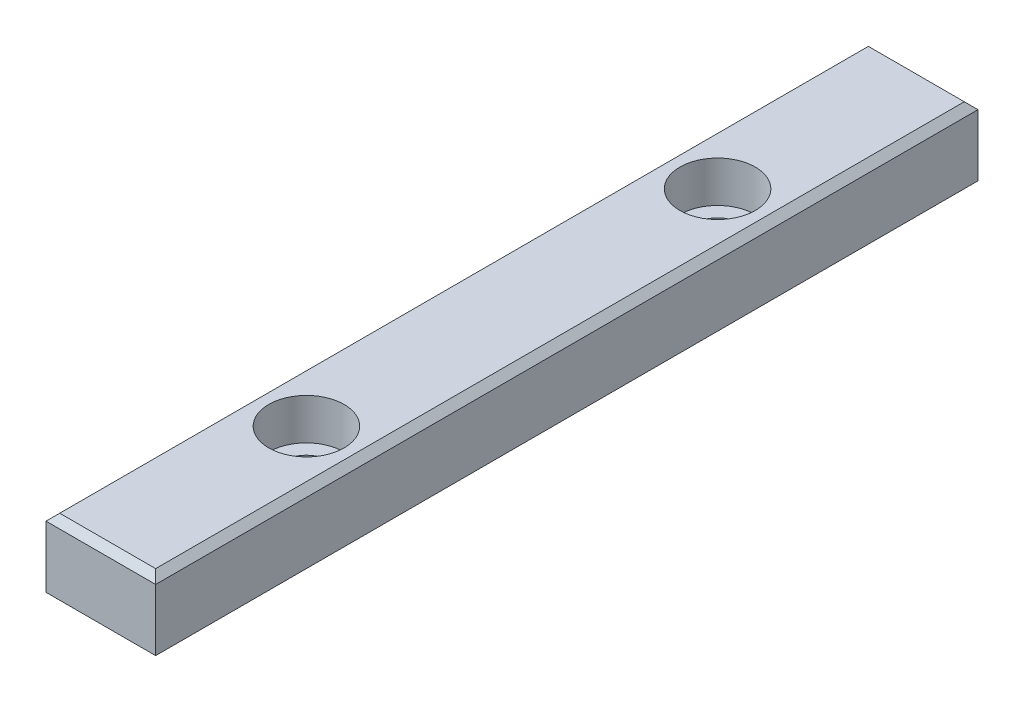
ISO-10303-21;
HEADER;
FILE_DESCRIPTION(('STEP AP214'),'2;1');
FILE_NAME('part.step','',(''),(''),'','','');
FILE_SCHEMA(('AUTOMOTIVE_DESIGN { 1 0 10303 214 1 1 1 1 }'));
ENDSEC;
DATA;
#1=APPLICATION_CONTEXT('core data for automotive mechanical design processes');
#2=APPLICATION_PROTOCOL_DEFINITION('international standard','automotive_design',2000,#1);
#3=PRODUCT_CONTEXT('',#1,'mechanical');
#4=PRODUCT('Part','Part','',(#3));
#5=PRODUCT_RELATED_PRODUCT_CATEGORY('part','',(#4));
#6=PRODUCT_DEFINITION_FORMATION('','',#4);
#7=PRODUCT_DEFINITION_CONTEXT('part definition',#1,'design');
#8=PRODUCT_DEFINITION('design','',#6,#7);
#9=PRODUCT_DEFINITION_SHAPE('','',#8);
#10=(LENGTH_UNIT() NAMED_UNIT(*) SI_UNIT(.MILLI.,.METRE.));
#11=(NAMED_UNIT(*) PLANE_ANGLE_UNIT() SI_UNIT($,.RADIAN.));
#12=(NAMED_UNIT(*) SI_UNIT($,.STERADIAN.) SOLID_ANGLE_UNIT());
#13=UNCERTAINTY_MEASURE_WITH_UNIT(LENGTH_MEASURE(1.E-05),#10,'distance_accuracy_value','');
#14=(GEOMETRIC_REPRESENTATION_CONTEXT(3) GLOBAL_UNCERTAINTY_ASSIGNED_CONTEXT((#13)) GLOBAL_UNIT_ASSIGNED_CONTEXT((#10,
#11,#12)) REPRESENTATION_CONTEXT('',''));
#15=CARTESIAN_POINT('',(0.,0.,0.));
#16=DIRECTION('',(0.,0.,1.));
#17=DIRECTION('',(1.,0.,0.));
#18=AXIS2_PLACEMENT_3D('',#15,#16,#17);
#19=CARTESIAN_POINT('',(7.99999999999999,-10.,60.));
#20=DIRECTION('',(1.,0.,0.));
#21=DIRECTION('',(0.,0.,-1.));
#22=AXIS2_PLACEMENT_3D('',#19,#20,#21);
#23=PLANE('',#22);
#24=DIRECTION('',(0.,1.,0.));
#25=VECTOR('',#24,1.);
#26=CARTESIAN_POINT('',(7.99999999999999,-10.,-60.));
#27=LINE('',#26,#25);
#28=CARTESIAN_POINT('',(7.99999999999999,-10.,-60.));
#29=VERTEX_POINT('',#28);
#30=CARTESIAN_POINT('',(7.99999999999999,-1.00000000000001,-60.));
#31=VERTEX_POINT('',#30);
#32=EDGE_CURVE('E85',#29,#31,#27,.T.);
#33=ORIENTED_EDGE('',*,*,#32,.T.);
#34=DIRECTION('',(0.,0.,1.));
#35=VECTOR('',#34,1.);
#36=CARTESIAN_POINT('',(7.99999999999999,-1.00000000000001,60.));
#37=LINE('',#36,#35);
#38=CARTESIAN_POINT('',(7.99999999999999,-1.00000000000001,60.));
#39=VERTEX_POINT('',#38);
#40=EDGE_CURVE('E131',#31,#39,#37,.T.);
#41=ORIENTED_EDGE('',*,*,#40,.T.);
#42=DIRECTION('',(0.,1.,0.));
#43=VECTOR('',#42,1.);
#44=CARTESIAN_POINT('',(7.99999999999999,-10.,60.));
#45=LINE('',#44,#43);
#46=CARTESIAN_POINT('',(7.99999999999999,-10.,60.));
#47=VERTEX_POINT('',#46);
#48=EDGE_CURVE('E108',#47,#39,#45,.T.);
#49=ORIENTED_EDGE('',*,*,#48,.F.);
#50=DIRECTION('',(0.,0.,-1.));
#51=VECTOR('',#50,1.);
#52=CARTESIAN_POINT('',(7.99999999999999,-10.,60.));
#53=LINE('',#52,#51);
#54=EDGE_CURVE('E103',#47,#29,#53,.T.);
#55=ORIENTED_EDGE('',*,*,#54,.T.);
#56=EDGE_LOOP('',(#33,#41,#49,#55));
#57=FACE_BOUND('',#56,.T.);
#58=ADVANCED_FACE('F32',(#57),#23,.T.);
#59=CARTESIAN_POINT('',(7.99999999999999,-10.,60.));
#60=DIRECTION('',(0.,0.,1.));
#61=DIRECTION('',(1.,0.,0.));
#62=AXIS2_PLACEMENT_3D('',#59,#60,#61);
#63=PLANE('',#62);
#64=ORIENTED_EDGE('',*,*,#48,.T.);
#65=DIRECTION('',(-1.,0.,0.));
#66=VECTOR('',#65,1.);
#67=CARTESIAN_POINT('',(7.99999999999999,-1.00000000000001,60.));
#68=LINE('',#67,#66);
#69=CARTESIAN_POINT('',(-8.00000000000001,-1.00000000000001,60.));
#70=VERTEX_POINT('',#69);
#71=EDGE_CURVE('E11',#39,#70,#68,.T.);
#72=ORIENTED_EDGE('',*,*,#71,.T.);
#73=DIRECTION('',(0.,1.,0.));
#74=VECTOR('',#73,1.);
#75=CARTESIAN_POINT('',(-8.00000000000001,-10.,60.));
#76=LINE('',#75,#74);
#77=CARTESIAN_POINT('',(-8.00000000000001,-10.,60.));
#78=VERTEX_POINT('',#77);
#79=EDGE_CURVE('E120',#78,#70,#76,.T.);
#80=ORIENTED_EDGE('',*,*,#79,.F.);
#81=DIRECTION('',(1.,0.,0.));
#82=VECTOR('',#81,1.);
#83=CARTESIAN_POINT('',(7.99999999999999,-10.,60.));
#84=LINE('',#83,#82);
#85=EDGE_CURVE('E96',#78,#47,#84,.T.);
#86=ORIENTED_EDGE('',*,*,#85,.T.);
#87=EDGE_LOOP('',(#64,#72,#80,#86));
#88=FACE_BOUND('',#87,.T.);
#89=ADVANCED_FACE('F154',(#88),#63,.T.);
#90=CARTESIAN_POINT('',(-8.00000000000001,-10.,60.));
#91=DIRECTION('',(-1.,0.,0.));
#92=DIRECTION('',(0.,0.,1.));
#93=AXIS2_PLACEMENT_3D('',#90,#91,#92);
#94=PLANE('',#93);
#95=ORIENTED_EDGE('',*,*,#79,.T.);
#96=DIRECTION('',(0.,0.,-1.));
#97=VECTOR('',#96,1.);
#98=CARTESIAN_POINT('',(-8.00000000000001,-1.00000000000001,60.));
#99=LINE('',#98,#97);
#100=CARTESIAN_POINT('',(-8.00000000000001,-1.00000000000001,-60.));
#101=VERTEX_POINT('',#100);
#102=EDGE_CURVE('E41',#70,#101,#99,.T.);
#103=ORIENTED_EDGE('',*,*,#102,.T.);
#104=DIRECTION('',(0.,1.,0.));
#105=VECTOR('',#104,1.);
#106=CARTESIAN_POINT('',(-8.00000000000001,-10.,-60.));
#107=LINE('',#106,#105);
#108=CARTESIAN_POINT('',(-8.00000000000001,-10.,-60.));
#109=VERTEX_POINT('',#108);
#110=EDGE_CURVE('E95',#109,#101,#107,.T.);
#111=ORIENTED_EDGE('',*,*,#110,.F.);
#112=DIRECTION('',(0.,0.,1.));
#113=VECTOR('',#112,1.);
#114=CARTESIAN_POINT('',(-8.00000000000001,-10.,60.));
#115=LINE('',#114,#113);
#116=EDGE_CURVE('E106',#109,#78,#115,.T.);
#117=ORIENTED_EDGE('',*,*,#116,.T.);
#118=EDGE_LOOP('',(#95,#103,#111,#117));
#119=FACE_BOUND('',#118,.T.);
#120=ADVANCED_FACE('F155',(#119),#94,.T.);
#121=CARTESIAN_POINT('',(7.99999999999999,-10.,-60.));
#122=DIRECTION('',(0.,0.,-1.));
#123=DIRECTION('',(-1.,0.,0.));
#124=AXIS2_PLACEMENT_3D('',#121,#122,#123);
#125=PLANE('',#124);
#126=ORIENTED_EDGE('',*,*,#110,.T.);
#127=DIRECTION('',(1.,0.,0.));
#128=VECTOR('',#127,1.);
#129=CARTESIAN_POINT('',(7.99999999999999,-1.00000000000001,-60.));
#130=LINE('',#129,#128);
#131=EDGE_CURVE('E90',#101,#31,#130,.T.);
#132=ORIENTED_EDGE('',*,*,#131,.T.);
#133=ORIENTED_EDGE('',*,*,#32,.F.);
#134=DIRECTION('',(-1.,0.,0.));
#135=VECTOR('',#134,1.);
#136=CARTESIAN_POINT('',(7.99999999999999,-10.,-60.));
#137=LINE('',#136,#135);
#138=EDGE_CURVE('E88',#29,#109,#137,.T.);
#139=ORIENTED_EDGE('',*,*,#138,.T.);
#140=EDGE_LOOP('',(#126,#132,#133,#139));
#141=FACE_BOUND('',#140,.T.);
#142=ADVANCED_FACE('F87',(#141),#125,.T.);
#143=CARTESIAN_POINT('',(7.99999999999999,-10.,-60.));
#144=DIRECTION('',(0.,1.,0.));
#145=DIRECTION('',(0.,0.,1.));
#146=AXIS2_PLACEMENT_3D('',#143,#144,#145);
#147=PLANE('',#146);
#148=CARTESIAN_POINT('',(0.,-10.,30.));
#149=DIRECTION('',(0.,1.,0.));
#150=DIRECTION('',(0.,0.,1.));
#151=AXIS2_PLACEMENT_3D('',#148,#149,#150);
#152=CIRCLE('',#151,3.3);
#153=CARTESIAN_POINT('',(0.,-10.,33.3));
#154=VERTEX_POINT('',#153);
#155=EDGE_CURVE('E228',#154,#154,#152,.T.);
#156=ORIENTED_EDGE('',*,*,#155,.T.);
#157=EDGE_LOOP('',(#156));
#158=FACE_BOUND('',#157,.T.);
#159=CARTESIAN_POINT('',(0.,-10.,-30.));
#160=DIRECTION('',(0.,1.,0.));
#161=DIRECTION('',(0.,0.,1.));
#162=AXIS2_PLACEMENT_3D('',#159,#160,#161);
#163=CIRCLE('',#162,3.3);
#164=CARTESIAN_POINT('',(0.,-10.,-26.7));
#165=VERTEX_POINT('',#164);
#166=EDGE_CURVE('E113',#165,#165,#163,.T.);
#167=ORIENTED_EDGE('',*,*,#166,.T.);
#168=EDGE_LOOP('',(#167));
#169=FACE_BOUND('',#168,.T.);
#170=ORIENTED_EDGE('',*,*,#54,.F.);
#171=ORIENTED_EDGE('',*,*,#85,.F.);
#172=ORIENTED_EDGE('',*,*,#116,.F.);
#173=ORIENTED_EDGE('',*,*,#138,.F.);
#174=EDGE_LOOP('',(#170,#171,#172,#173));
#175=FACE_BOUND('',#174,.T.);
#176=ADVANCED_FACE('F101',(#158,#169,#175),#147,.F.);
#177=CARTESIAN_POINT('',(7.99999999999999,0.,-60.));
#178=DIRECTION('',(0.,1.,0.));
#179=DIRECTION('',(0.,0.,1.));
#180=AXIS2_PLACEMENT_3D('',#177,#178,#179);
#181=PLANE('',#180);
#182=CARTESIAN_POINT('',(0.,0.,30.));
#183=DIRECTION('',(0.,1.,0.));
#184=DIRECTION('',(0.,0.,1.));
#185=AXIS2_PLACEMENT_3D('',#182,#183,#184);
#186=CIRCLE('',#185,5.49999999999999);
#187=CARTESIAN_POINT('',(0.,0.,35.5));
#188=VERTEX_POINT('',#187);
#189=EDGE_CURVE('E221',#188,#188,#186,.T.);
#190=ORIENTED_EDGE('',*,*,#189,.F.);
#191=EDGE_LOOP('',(#190));
#192=FACE_BOUND('',#191,.T.);
#193=CARTESIAN_POINT('',(0.,0.,-30.));
#194=DIRECTION('',(0.,1.,0.));
#195=DIRECTION('',(0.,0.,1.));
#196=AXIS2_PLACEMENT_3D('',#193,#194,#195);
#197=CIRCLE('',#196,5.49999999999999);
#198=CARTESIAN_POINT('',(0.,0.,-24.5));
#199=VERTEX_POINT('',#198);
#200=EDGE_CURVE('E231',#199,#199,#197,.T.);
#201=ORIENTED_EDGE('',*,*,#200,.F.);
#202=EDGE_LOOP('',(#201));
#203=FACE_BOUND('',#202,.T.);
#204=DIRECTION('',(1.,0.,0.));
#205=VECTOR('',#204,1.);
#206=CARTESIAN_POINT('',(7.99999999999999,0.,59.));
#207=LINE('',#206,#205);
#208=CARTESIAN_POINT('',(-7.,0.,59.));
#209=VERTEX_POINT('',#208);
#210=CARTESIAN_POINT('',(6.99999999999999,0.,59.));
#211=VERTEX_POINT('',#210);
#212=EDGE_CURVE('E119',#209,#211,#207,.T.);
#213=ORIENTED_EDGE('',*,*,#212,.T.);
#214=DIRECTION('',(0.,0.,-1.));
#215=VECTOR('',#214,1.);
#216=CARTESIAN_POINT('',(6.99999999999999,0.,-60.));
#217=LINE('',#216,#215);
#218=CARTESIAN_POINT('',(6.99999999999999,0.,-59.));
#219=VERTEX_POINT('',#218);
#220=EDGE_CURVE('E128',#211,#219,#217,.T.);
#221=ORIENTED_EDGE('',*,*,#220,.T.);
#222=DIRECTION('',(-1.,0.,0.));
#223=VECTOR('',#222,1.);
#224=CARTESIAN_POINT('',(7.99999999999999,0.,-59.));
#225=LINE('',#224,#223);
#226=CARTESIAN_POINT('',(-7.,0.,-59.));
#227=VERTEX_POINT('',#226);
#228=EDGE_CURVE('E126',#219,#227,#225,.T.);
#229=ORIENTED_EDGE('',*,*,#228,.T.);
#230=DIRECTION('',(0.,0.,1.));
#231=VECTOR('',#230,1.);
#232=CARTESIAN_POINT('',(-7.,0.,-60.));
#233=LINE('',#232,#231);
#234=EDGE_CURVE('E124',#227,#209,#233,.T.);
#235=ORIENTED_EDGE('',*,*,#234,.T.);
#236=EDGE_LOOP('',(#213,#221,#229,#235));
#237=FACE_BOUND('',#236,.T.);
#238=ADVANCED_FACE('F149',(#192,#203,#237),#181,.T.);
#239=CARTESIAN_POINT('',(-7.,0.,-60.));
#240=DIRECTION('',(0.707106781186552,-0.707106781186542,0.));
#241=DIRECTION('',(0.707106781186543,0.707106781186552,0.));
#242=AXIS2_PLACEMENT_3D('',#239,#240,#241);
#243=PLANE('',#242);
#244=DIRECTION('',(-0.577350269189623,-0.577350269189631,-0.577350269189623));
#245=VECTOR('',#244,1.);
#246=CARTESIAN_POINT('',(-7.33333333333333,-0.333333333333335,-59.3333333333333));
#247=LINE('',#246,#245);
#248=EDGE_CURVE('E111',#101,#227,#247,.F.);
#249=ORIENTED_EDGE('',*,*,#248,.F.);
#250=ORIENTED_EDGE('',*,*,#102,.F.);
#251=DIRECTION('',(-0.577350269189624,-0.577350269189633,0.577350269189621));
#252=VECTOR('',#251,1.);
#253=CARTESIAN_POINT('',(-2.00000000000003,5.00000000000004,54.));
#254=LINE('',#253,#252);
#255=EDGE_CURVE('E36',#209,#70,#254,.T.);
#256=ORIENTED_EDGE('',*,*,#255,.F.);
#257=ORIENTED_EDGE('',*,*,#234,.F.);
#258=EDGE_LOOP('',(#249,#250,#256,#257));
#259=FACE_BOUND('',#258,.T.);
#260=ADVANCED_FACE('F34',(#259),#243,.F.);
#261=CARTESIAN_POINT('',(7.99999999999999,0.,59.));
#262=DIRECTION('',(0.,-0.70710678118654,-0.707106781186555));
#263=DIRECTION('',(0.,0.707106781186555,-0.70710678118654));
#264=AXIS2_PLACEMENT_3D('',#261,#262,#263);
#265=PLANE('',#264);
#266=ORIENTED_EDGE('',*,*,#255,.T.);
#267=ORIENTED_EDGE('',*,*,#71,.F.);
#268=DIRECTION('',(-0.577350269189624,0.577350269189633,-0.577350269189621));
#269=VECTOR('',#268,1.);
#270=CARTESIAN_POINT('',(7.33333333333333,-0.333333333333337,59.3333333333333));
#271=LINE('',#270,#269);
#272=EDGE_CURVE('E137',#211,#39,#271,.F.);
#273=ORIENTED_EDGE('',*,*,#272,.F.);
#274=ORIENTED_EDGE('',*,*,#212,.F.);
#275=EDGE_LOOP('',(#266,#267,#273,#274));
#276=FACE_BOUND('',#275,.T.);
#277=ADVANCED_FACE('F173',(#276),#265,.F.);
#278=CARTESIAN_POINT('',(7.99999999999999,0.,-59.));
#279=DIRECTION('',(0.,-0.707106781186542,0.707106781186552));
#280=DIRECTION('',(0.,-0.707106781186552,-0.707106781186543));
#281=AXIS2_PLACEMENT_3D('',#278,#279,#280);
#282=PLANE('',#281);
#283=ORIENTED_EDGE('',*,*,#248,.T.);
#284=ORIENTED_EDGE('',*,*,#228,.F.);
#285=DIRECTION('',(0.577350269189623,-0.577350269189631,-0.577350269189623));
#286=VECTOR('',#285,1.);
#287=CARTESIAN_POINT('',(7.33333333333332,-0.333333333333335,-59.3333333333333));
#288=LINE('',#287,#286);
#289=EDGE_CURVE('E135',#31,#219,#288,.F.);
#290=ORIENTED_EDGE('',*,*,#289,.F.);
#291=ORIENTED_EDGE('',*,*,#131,.F.);
#292=EDGE_LOOP('',(#283,#284,#290,#291));
#293=FACE_BOUND('',#292,.T.);
#294=ADVANCED_FACE('F142',(#293),#282,.F.);
#295=CARTESIAN_POINT('',(6.99999999999999,0.,-60.));
#296=DIRECTION('',(-0.707106781186552,-0.707106781186542,0.));
#297=DIRECTION('',(0.707106781186543,-0.707106781186552,0.));
#298=AXIS2_PLACEMENT_3D('',#295,#296,#297);
#299=PLANE('',#298);
#300=ORIENTED_EDGE('',*,*,#272,.T.);
#301=ORIENTED_EDGE('',*,*,#40,.F.);
#302=ORIENTED_EDGE('',*,*,#289,.T.);
#303=ORIENTED_EDGE('',*,*,#220,.F.);
#304=EDGE_LOOP('',(#300,#301,#302,#303));
#305=FACE_BOUND('',#304,.T.);
#306=ADVANCED_FACE('F153',(#305),#299,.F.);
#307=CARTESIAN_POINT('',(0.,0.,-30.));
#308=DIRECTION('',(0.,1.,0.));
#309=DIRECTION('',(0.,0.,1.));
#310=AXIS2_PLACEMENT_3D('',#307,#308,#309);
#311=CYLINDRICAL_SURFACE('',#310,3.3);
#312=ORIENTED_EDGE('',*,*,#166,.F.);
#313=EDGE_LOOP('',(#312));
#314=FACE_BOUND('',#313,.T.);
#315=CARTESIAN_POINT('',(0.,-6.,-30.));
#316=DIRECTION('',(0.,1.,0.));
#317=DIRECTION('',(0.,0.,1.));
#318=AXIS2_PLACEMENT_3D('',#315,#316,#317);
#319=CIRCLE('',#318,3.3);
#320=CARTESIAN_POINT('',(0.,-6.,-26.7));
#321=VERTEX_POINT('',#320);
#322=EDGE_CURVE('E236',#321,#321,#319,.T.);
#323=ORIENTED_EDGE('',*,*,#322,.T.);
#324=EDGE_LOOP('',(#323));
#325=FACE_BOUND('',#324,.T.);
#326=ADVANCED_FACE('F171',(#314,#325),#311,.F.);
#327=CARTESIAN_POINT('',(3.3,-6.,-30.));
#328=DIRECTION('',(0.,-1.,0.));
#329=DIRECTION('',(0.,0.,-1.));
#330=AXIS2_PLACEMENT_3D('',#327,#328,#329);
#331=PLANE('',#330);
#332=ORIENTED_EDGE('',*,*,#322,.F.);
#333=EDGE_LOOP('',(#332));
#334=FACE_BOUND('',#333,.T.);
#335=CARTESIAN_POINT('',(0.,-6.,-30.));
#336=DIRECTION('',(0.,1.,0.));
#337=DIRECTION('',(0.,0.,1.));
#338=AXIS2_PLACEMENT_3D('',#335,#336,#337);
#339=CIRCLE('',#338,5.5);
#340=CARTESIAN_POINT('',(0.,-6.,-24.5));
#341=VERTEX_POINT('',#340);
#342=EDGE_CURVE('E234',#341,#341,#339,.T.);
#343=ORIENTED_EDGE('',*,*,#342,.T.);
#344=EDGE_LOOP('',(#343));
#345=FACE_BOUND('',#344,.T.);
#346=ADVANCED_FACE('F194',(#334,#345),#331,.F.);
#347=CARTESIAN_POINT('',(0.,0.,-30.));
#348=DIRECTION('',(0.,1.,0.));
#349=DIRECTION('',(0.,0.,1.));
#350=AXIS2_PLACEMENT_3D('',#347,#348,#349);
#351=CYLINDRICAL_SURFACE('',#350,5.5);
#352=ORIENTED_EDGE('',*,*,#342,.F.);
#353=EDGE_LOOP('',(#352));
#354=FACE_BOUND('',#353,.T.);
#355=ORIENTED_EDGE('',*,*,#200,.T.);
#356=EDGE_LOOP('',(#355));
#357=FACE_BOUND('',#356,.T.);
#358=ADVANCED_FACE('F198',(#354,#357),#351,.F.);
#359=CARTESIAN_POINT('',(0.,0.,30.));
#360=DIRECTION('',(0.,1.,0.));
#361=DIRECTION('',(0.,0.,1.));
#362=AXIS2_PLACEMENT_3D('',#359,#360,#361);
#363=CYLINDRICAL_SURFACE('',#362,3.3);
#364=ORIENTED_EDGE('',*,*,#155,.F.);
#365=EDGE_LOOP('',(#364));
#366=FACE_BOUND('',#365,.T.);
#367=CARTESIAN_POINT('',(0.,-6.,30.));
#368=DIRECTION('',(0.,1.,0.));
#369=DIRECTION('',(0.,0.,1.));
#370=AXIS2_PLACEMENT_3D('',#367,#368,#369);
#371=CIRCLE('',#370,3.3);
#372=CARTESIAN_POINT('',(0.,-6.,33.3));
#373=VERTEX_POINT('',#372);
#374=EDGE_CURVE('E223',#373,#373,#371,.T.);
#375=ORIENTED_EDGE('',*,*,#374,.T.);
#376=EDGE_LOOP('',(#375));
#377=FACE_BOUND('',#376,.T.);
#378=ADVANCED_FACE('F202',(#366,#377),#363,.F.);
#379=CARTESIAN_POINT('',(3.3,-6.,30.));
#380=DIRECTION('',(0.,-1.,0.));
#381=DIRECTION('',(0.,0.,-1.));
#382=AXIS2_PLACEMENT_3D('',#379,#380,#381);
#383=PLANE('',#382);
#384=ORIENTED_EDGE('',*,*,#374,.F.);
#385=EDGE_LOOP('',(#384));
#386=FACE_BOUND('',#385,.T.);
#387=CARTESIAN_POINT('',(0.,-6.,30.));
#388=DIRECTION('',(0.,1.,0.));
#389=DIRECTION('',(0.,0.,1.));
#390=AXIS2_PLACEMENT_3D('',#387,#388,#389);
#391=CIRCLE('',#390,5.5);
#392=CARTESIAN_POINT('',(0.,-6.,35.5));
#393=VERTEX_POINT('',#392);
#394=EDGE_CURVE('E219',#393,#393,#391,.T.);
#395=ORIENTED_EDGE('',*,*,#394,.T.);
#396=EDGE_LOOP('',(#395));
#397=FACE_BOUND('',#396,.T.);
#398=ADVANCED_FACE('F206',(#386,#397),#383,.F.);
#399=CARTESIAN_POINT('',(0.,0.,30.));
#400=DIRECTION('',(0.,1.,0.));
#401=DIRECTION('',(0.,0.,1.));
#402=AXIS2_PLACEMENT_3D('',#399,#400,#401);
#403=CYLINDRICAL_SURFACE('',#402,5.5);
#404=ORIENTED_EDGE('',*,*,#394,.F.);
#405=EDGE_LOOP('',(#404));
#406=FACE_BOUND('',#405,.T.);
#407=ORIENTED_EDGE('',*,*,#189,.T.);
#408=EDGE_LOOP('',(#407));
#409=FACE_BOUND('',#408,.T.);
#410=ADVANCED_FACE('F210',(#406,#409),#403,.F.);
#411=CLOSED_SHELL('',(#58,#89,#120,#142,#176,#238,#260,#277,#294,#306,#326,#346,#358,#378,#398,#410));
#412=MANIFOLD_SOLID_BREP('B2',#411);
#413=ADVANCED_BREP_SHAPE_REPRESENTATION('',(#18,#412),#14);
#414=SHAPE_DEFINITION_REPRESENTATION(#9,#413);
ENDSEC;
END-ISO-10303-21;
